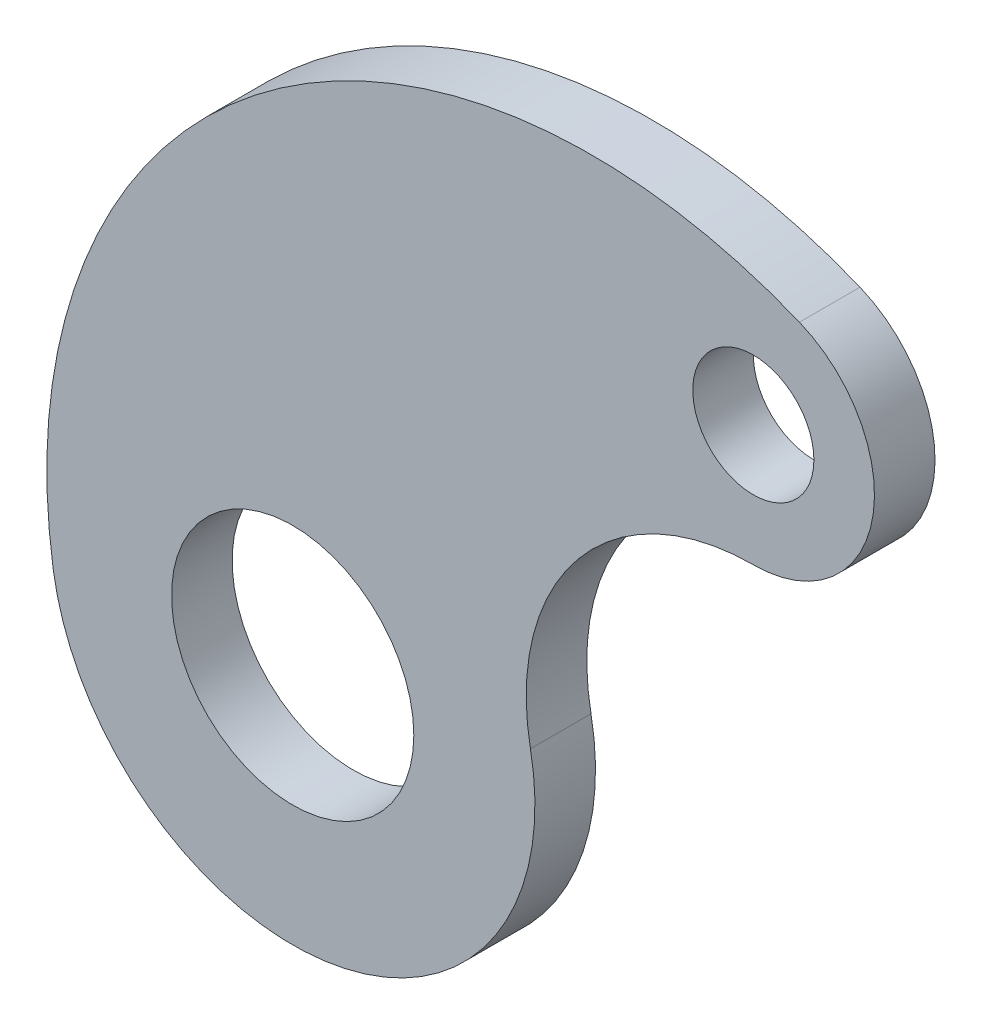
ISO-10303-21;
HEADER;
FILE_DESCRIPTION(('STEP AP214'),'2;1');
FILE_NAME('part.step','',(''),(''),'','','');
FILE_SCHEMA(('AUTOMOTIVE_DESIGN { 1 0 10303 214 1 1 1 1 }'));
ENDSEC;
DATA;
#1=APPLICATION_CONTEXT('core data for automotive mechanical design processes');
#2=APPLICATION_PROTOCOL_DEFINITION('international standard','automotive_design',2000,#1);
#3=PRODUCT_CONTEXT('',#1,'mechanical');
#4=PRODUCT('Part','Part','',(#3));
#5=PRODUCT_RELATED_PRODUCT_CATEGORY('part','',(#4));
#6=PRODUCT_DEFINITION_FORMATION('','',#4);
#7=PRODUCT_DEFINITION_CONTEXT('part definition',#1,'design');
#8=PRODUCT_DEFINITION('design','',#6,#7);
#9=PRODUCT_DEFINITION_SHAPE('','',#8);
#10=(LENGTH_UNIT() NAMED_UNIT(*) SI_UNIT(.MILLI.,.METRE.));
#11=(NAMED_UNIT(*) PLANE_ANGLE_UNIT() SI_UNIT($,.RADIAN.));
#12=(NAMED_UNIT(*) SI_UNIT($,.STERADIAN.) SOLID_ANGLE_UNIT());
#13=UNCERTAINTY_MEASURE_WITH_UNIT(LENGTH_MEASURE(1.E-05),#10,'distance_accuracy_value','');
#14=(GEOMETRIC_REPRESENTATION_CONTEXT(3) GLOBAL_UNCERTAINTY_ASSIGNED_CONTEXT((#13)) GLOBAL_UNIT_ASSIGNED_CONTEXT((#10,
#11,#12)) REPRESENTATION_CONTEXT('',''));
#15=CARTESIAN_POINT('',(0.,0.,0.));
#16=DIRECTION('',(0.,0.,1.));
#17=DIRECTION('',(1.,0.,0.));
#18=AXIS2_PLACEMENT_3D('',#15,#16,#17);
#19=CARTESIAN_POINT('',(125.465452039523,80.0526098545079,20.));
#20=DIRECTION('',(0.,0.,-1.));
#21=DIRECTION('',(-1.,0.,0.));
#22=AXIS2_PLACEMENT_3D('',#19,#20,#21);
#23=PLANE('',#22);
#24=CARTESIAN_POINT('',(98.819115517865,15.3226110133637,20.));
#25=DIRECTION('',(0.,0.,1.));
#26=DIRECTION('',(-1.,0.,0.));
#27=AXIS2_PLACEMENT_3D('',#24,#25,#26);
#28=CIRCLE('',#27,180.);
#29=CARTESIAN_POINT('',(167.338266573558,181.77117946202,20.));
#30=VERTEX_POINT('',#29);
#31=CARTESIAN_POINT('',(-79.055292414292,-12.2580888106909,20.));
#32=VERTEX_POINT('',#31);
#33=EDGE_CURVE('E85',#30,#32,#28,.T.);
#34=ORIENTED_EDGE('',*,*,#33,.T.);
#35=CARTESIAN_POINT('',(0.,0.,20.));
#36=DIRECTION('',(0.,0.,1.));
#37=DIRECTION('',(1.,0.,0.));
#38=AXIS2_PLACEMENT_3D('',#35,#36,#37);
#39=CIRCLE('',#38,80.);
#40=CARTESIAN_POINT('',(78.5093102251261,15.3716690042076,20.));
#41=VERTEX_POINT('',#40);
#42=EDGE_CURVE('E80',#32,#41,#39,.T.);
#43=ORIENTED_EDGE('',*,*,#42,.T.);
#44=CARTESIAN_POINT('',(152.111788561182,29.7826086956522,20.));
#45=DIRECTION('',(0.,0.,-1.));
#46=DIRECTION('',(-1.,0.,0.));
#47=AXIS2_PLACEMENT_3D('',#44,#45,#46);
#48=CIRCLE('',#47,75.);
#49=CARTESIAN_POINT('',(152.111788561182,104.782608695652,20.));
#50=VERTEX_POINT('',#49);
#51=EDGE_CURVE('E83',#41,#50,#48,.T.);
#52=ORIENTED_EDGE('',*,*,#51,.T.);
#53=CARTESIAN_POINT('',(152.111788561182,144.782608695652,20.));
#54=DIRECTION('',(0.,0.,1.));
#55=DIRECTION('',(1.,0.,0.));
#56=AXIS2_PLACEMENT_3D('',#53,#54,#55);
#57=CIRCLE('',#56,40.);
#58=EDGE_CURVE('E50',#50,#30,#57,.T.);
#59=ORIENTED_EDGE('',*,*,#58,.T.);
#60=EDGE_LOOP('',(#34,#43,#52,#59));
#61=FACE_BOUND('',#60,.T.);
#62=CARTESIAN_POINT('',(0.,0.,20.));
#63=DIRECTION('',(0.,0.,1.));
#64=DIRECTION('',(1.,0.,0.));
#65=AXIS2_PLACEMENT_3D('',#62,#63,#64);
#66=CIRCLE('',#65,40.);
#67=CARTESIAN_POINT('',(40.,0.,20.));
#68=VERTEX_POINT('',#67);
#69=EDGE_CURVE('E100',#68,#68,#66,.T.);
#70=ORIENTED_EDGE('',*,*,#69,.F.);
#71=EDGE_LOOP('',(#70));
#72=FACE_BOUND('',#71,.T.);
#73=CARTESIAN_POINT('',(152.111788561182,144.782608695652,20.));
#74=DIRECTION('',(0.,0.,1.));
#75=DIRECTION('',(1.,0.,0.));
#76=AXIS2_PLACEMENT_3D('',#73,#74,#75);
#77=CIRCLE('',#76,20.);
#78=CARTESIAN_POINT('',(172.111788561182,144.782608695652,20.));
#79=VERTEX_POINT('',#78);
#80=EDGE_CURVE('E115',#79,#79,#77,.T.);
#81=ORIENTED_EDGE('',*,*,#80,.F.);
#82=EDGE_LOOP('',(#81));
#83=FACE_BOUND('',#82,.T.);
#84=ADVANCED_FACE('F33',(#61,#72,#83),#23,.F.);
#85=CARTESIAN_POINT('',(125.465452039523,80.0526098545079,0.));
#86=DIRECTION('',(0.,0.,-1.));
#87=DIRECTION('',(-1.,0.,0.));
#88=AXIS2_PLACEMENT_3D('',#85,#86,#87);
#89=PLANE('',#88);
#90=CARTESIAN_POINT('',(0.,0.,0.));
#91=DIRECTION('',(0.,0.,1.));
#92=DIRECTION('',(1.,0.,0.));
#93=AXIS2_PLACEMENT_3D('',#90,#91,#92);
#94=CIRCLE('',#93,40.);
#95=CARTESIAN_POINT('',(40.,0.,0.));
#96=VERTEX_POINT('',#95);
#97=EDGE_CURVE('E112',#96,#96,#94,.T.);
#98=ORIENTED_EDGE('',*,*,#97,.T.);
#99=EDGE_LOOP('',(#98));
#100=FACE_BOUND('',#99,.T.);
#101=CARTESIAN_POINT('',(98.819115517865,15.3226110133637,0.));
#102=DIRECTION('',(0.,0.,1.));
#103=DIRECTION('',(-1.,0.,0.));
#104=AXIS2_PLACEMENT_3D('',#101,#102,#103);
#105=CIRCLE('',#104,180.);
#106=CARTESIAN_POINT('',(167.338266573558,181.77117946202,0.));
#107=VERTEX_POINT('',#106);
#108=CARTESIAN_POINT('',(-79.055292414292,-12.2580888106909,0.));
#109=VERTEX_POINT('',#108);
#110=EDGE_CURVE('E97',#107,#109,#105,.T.);
#111=ORIENTED_EDGE('',*,*,#110,.F.);
#112=CARTESIAN_POINT('',(152.111788561182,144.782608695652,0.));
#113=DIRECTION('',(0.,0.,1.));
#114=DIRECTION('',(1.,0.,0.));
#115=AXIS2_PLACEMENT_3D('',#112,#113,#114);
#116=CIRCLE('',#115,40.);
#117=CARTESIAN_POINT('',(152.111788561182,104.782608695652,0.));
#118=VERTEX_POINT('',#117);
#119=EDGE_CURVE('E73',#118,#107,#116,.T.);
#120=ORIENTED_EDGE('',*,*,#119,.F.);
#121=CARTESIAN_POINT('',(152.111788561182,29.7826086956522,0.));
#122=DIRECTION('',(0.,0.,-1.));
#123=DIRECTION('',(-1.,0.,0.));
#124=AXIS2_PLACEMENT_3D('',#121,#122,#123);
#125=CIRCLE('',#124,75.);
#126=CARTESIAN_POINT('',(78.5093102251261,15.3716690042076,0.));
#127=VERTEX_POINT('',#126);
#128=EDGE_CURVE('E67',#127,#118,#125,.T.);
#129=ORIENTED_EDGE('',*,*,#128,.F.);
#130=CARTESIAN_POINT('',(0.,0.,0.));
#131=DIRECTION('',(0.,0.,1.));
#132=DIRECTION('',(1.,0.,0.));
#133=AXIS2_PLACEMENT_3D('',#130,#131,#132);
#134=CIRCLE('',#133,80.);
#135=EDGE_CURVE('E89',#109,#127,#134,.T.);
#136=ORIENTED_EDGE('',*,*,#135,.F.);
#137=EDGE_LOOP('',(#111,#120,#129,#136));
#138=FACE_BOUND('',#137,.T.);
#139=CARTESIAN_POINT('',(152.111788561182,144.782608695652,0.));
#140=DIRECTION('',(0.,0.,1.));
#141=DIRECTION('',(1.,0.,0.));
#142=AXIS2_PLACEMENT_3D('',#139,#140,#141);
#143=CIRCLE('',#142,20.);
#144=CARTESIAN_POINT('',(172.111788561182,144.782608695652,0.));
#145=VERTEX_POINT('',#144);
#146=EDGE_CURVE('E118',#145,#145,#143,.T.);
#147=ORIENTED_EDGE('',*,*,#146,.T.);
#148=EDGE_LOOP('',(#147));
#149=FACE_BOUND('',#148,.T.);
#150=ADVANCED_FACE('F108',(#100,#138,#149),#89,.T.);
#151=CARTESIAN_POINT('',(98.819115517865,15.3226110133637,20.));
#152=DIRECTION('',(0.,0.,-1.));
#153=DIRECTION('',(-1.,0.,0.));
#154=AXIS2_PLACEMENT_3D('',#151,#152,#153);
#155=CYLINDRICAL_SURFACE('',#154,180.);
#156=ORIENTED_EDGE('',*,*,#110,.T.);
#157=DIRECTION('',(0.,0.,-1.));
#158=VECTOR('',#157,1.);
#159=CARTESIAN_POINT('',(-79.055292414292,-12.2580888106909,20.));
#160=LINE('',#159,#158);
#161=EDGE_CURVE('E11',#32,#109,#160,.T.);
#162=ORIENTED_EDGE('',*,*,#161,.F.);
#163=ORIENTED_EDGE('',*,*,#33,.F.);
#164=DIRECTION('',(0.,0.,-1.));
#165=VECTOR('',#164,1.);
#166=CARTESIAN_POINT('',(167.338266573558,181.77117946202,20.));
#167=LINE('',#166,#165);
#168=EDGE_CURVE('E93',#30,#107,#167,.T.);
#169=ORIENTED_EDGE('',*,*,#168,.T.);
#170=EDGE_LOOP('',(#156,#162,#163,#169));
#171=FACE_BOUND('',#170,.T.);
#172=ADVANCED_FACE('F35',(#171),#155,.T.);
#173=CARTESIAN_POINT('',(0.,0.,20.));
#174=DIRECTION('',(0.,0.,-1.));
#175=DIRECTION('',(-1.,0.,0.));
#176=AXIS2_PLACEMENT_3D('',#173,#174,#175);
#177=CYLINDRICAL_SURFACE('',#176,80.);
#178=ORIENTED_EDGE('',*,*,#135,.T.);
#179=DIRECTION('',(0.,0.,-1.));
#180=VECTOR('',#179,1.);
#181=CARTESIAN_POINT('',(78.5093102251261,15.3716690042076,20.));
#182=LINE('',#181,#180);
#183=EDGE_CURVE('E42',#41,#127,#182,.T.);
#184=ORIENTED_EDGE('',*,*,#183,.F.);
#185=ORIENTED_EDGE('',*,*,#42,.F.);
#186=ORIENTED_EDGE('',*,*,#161,.T.);
#187=EDGE_LOOP('',(#178,#184,#185,#186));
#188=FACE_BOUND('',#187,.T.);
#189=ADVANCED_FACE('F88',(#188),#177,.T.);
#190=CARTESIAN_POINT('',(152.111788561182,29.7826086956522,20.));
#191=DIRECTION('',(0.,0.,-1.));
#192=DIRECTION('',(-1.,0.,0.));
#193=AXIS2_PLACEMENT_3D('',#190,#191,#192);
#194=CYLINDRICAL_SURFACE('',#193,75.);
#195=ORIENTED_EDGE('',*,*,#128,.T.);
#196=DIRECTION('',(0.,0.,-1.));
#197=VECTOR('',#196,1.);
#198=CARTESIAN_POINT('',(152.111788561182,104.782608695652,20.));
#199=LINE('',#198,#197);
#200=EDGE_CURVE('E90',#50,#118,#199,.T.);
#201=ORIENTED_EDGE('',*,*,#200,.F.);
#202=ORIENTED_EDGE('',*,*,#51,.F.);
#203=ORIENTED_EDGE('',*,*,#183,.T.);
#204=EDGE_LOOP('',(#195,#201,#202,#203));
#205=FACE_BOUND('',#204,.T.);
#206=ADVANCED_FACE('F91',(#205),#194,.F.);
#207=CARTESIAN_POINT('',(152.111788561182,144.782608695652,20.));
#208=DIRECTION('',(0.,0.,-1.));
#209=DIRECTION('',(-1.,0.,0.));
#210=AXIS2_PLACEMENT_3D('',#207,#208,#209);
#211=CYLINDRICAL_SURFACE('',#210,40.);
#212=ORIENTED_EDGE('',*,*,#119,.T.);
#213=ORIENTED_EDGE('',*,*,#168,.F.);
#214=ORIENTED_EDGE('',*,*,#58,.F.);
#215=ORIENTED_EDGE('',*,*,#200,.T.);
#216=EDGE_LOOP('',(#212,#213,#214,#215));
#217=FACE_BOUND('',#216,.T.);
#218=ADVANCED_FACE('F105',(#217),#211,.T.);
#219=CARTESIAN_POINT('',(0.,0.,20.));
#220=DIRECTION('',(0.,0.,-1.));
#221=DIRECTION('',(-1.,0.,0.));
#222=AXIS2_PLACEMENT_3D('',#219,#220,#221);
#223=CYLINDRICAL_SURFACE('',#222,40.);
#224=ORIENTED_EDGE('',*,*,#69,.T.);
#225=EDGE_LOOP('',(#224));
#226=FACE_BOUND('',#225,.T.);
#227=ORIENTED_EDGE('',*,*,#97,.F.);
#228=EDGE_LOOP('',(#227));
#229=FACE_BOUND('',#228,.T.);
#230=ADVANCED_FACE('F135',(#226,#229),#223,.F.);
#231=CARTESIAN_POINT('',(152.111788561182,144.782608695652,20.));
#232=DIRECTION('',(0.,0.,-1.));
#233=DIRECTION('',(-1.,0.,0.));
#234=AXIS2_PLACEMENT_3D('',#231,#232,#233);
#235=CYLINDRICAL_SURFACE('',#234,20.);
#236=ORIENTED_EDGE('',*,*,#80,.T.);
#237=EDGE_LOOP('',(#236));
#238=FACE_BOUND('',#237,.T.);
#239=ORIENTED_EDGE('',*,*,#146,.F.);
#240=EDGE_LOOP('',(#239));
#241=FACE_BOUND('',#240,.T.);
#242=ADVANCED_FACE('F124',(#238,#241),#235,.F.);
#243=CLOSED_SHELL('',(#84,#150,#172,#189,#206,#218,#230,#242));
#244=MANIFOLD_SOLID_BREP('B2',#243);
#245=ADVANCED_BREP_SHAPE_REPRESENTATION('',(#18,#244),#14);
#246=SHAPE_DEFINITION_REPRESENTATION(#9,#245);
ENDSEC;
END-ISO-10303-21;
